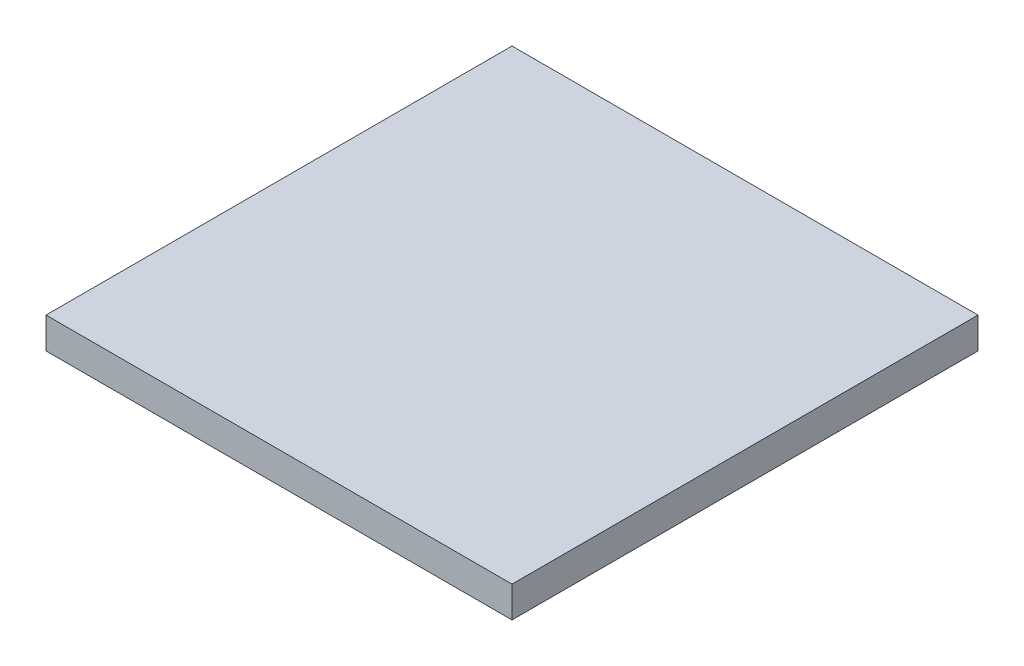
ISO-10303-21;
HEADER;
FILE_DESCRIPTION(('STEP AP214'),'2;1');
FILE_NAME('part.step','',(''),(''),'','','');
FILE_SCHEMA(('AUTOMOTIVE_DESIGN { 1 0 10303 214 1 1 1 1 }'));
ENDSEC;
DATA;
#1=APPLICATION_CONTEXT('core data for automotive mechanical design processes');
#2=APPLICATION_PROTOCOL_DEFINITION('international standard','automotive_design',2000,#1);
#3=PRODUCT_CONTEXT('',#1,'mechanical');
#4=PRODUCT('Part','Part','',(#3));
#5=PRODUCT_RELATED_PRODUCT_CATEGORY('part','',(#4));
#6=PRODUCT_DEFINITION_FORMATION('','',#4);
#7=PRODUCT_DEFINITION_CONTEXT('part definition',#1,'design');
#8=PRODUCT_DEFINITION('design','',#6,#7);
#9=PRODUCT_DEFINITION_SHAPE('','',#8);
#10=(LENGTH_UNIT() NAMED_UNIT(*) SI_UNIT(.MILLI.,.METRE.));
#11=(NAMED_UNIT(*) PLANE_ANGLE_UNIT() SI_UNIT($,.RADIAN.));
#12=(NAMED_UNIT(*) SI_UNIT($,.STERADIAN.) SOLID_ANGLE_UNIT());
#13=UNCERTAINTY_MEASURE_WITH_UNIT(LENGTH_MEASURE(1.E-05),#10,'distance_accuracy_value','');
#14=(GEOMETRIC_REPRESENTATION_CONTEXT(3) GLOBAL_UNCERTAINTY_ASSIGNED_CONTEXT((#13)) GLOBAL_UNIT_ASSIGNED_CONTEXT((#10,
#11,#12)) REPRESENTATION_CONTEXT('',''));
#15=CARTESIAN_POINT('',(0.,0.,0.));
#16=DIRECTION('',(0.,0.,1.));
#17=DIRECTION('',(1.,0.,0.));
#18=AXIS2_PLACEMENT_3D('',#15,#16,#17);
#19=CARTESIAN_POINT('',(-15.,2.,15.));
#20=DIRECTION('',(1.,0.,0.));
#21=DIRECTION('',(0.,0.,-1.));
#22=AXIS2_PLACEMENT_3D('',#19,#20,#21);
#23=PLANE('',#22);
#24=DIRECTION('',(0.,0.,1.));
#25=VECTOR('',#24,1.);
#26=CARTESIAN_POINT('',(-15.,0.,15.));
#27=LINE('',#26,#25);
#28=CARTESIAN_POINT('',(-15.,0.,-15.));
#29=VERTEX_POINT('',#28);
#30=CARTESIAN_POINT('',(-15.,0.,15.));
#31=VERTEX_POINT('',#30);
#32=EDGE_CURVE('E95',#29,#31,#27,.T.);
#33=ORIENTED_EDGE('',*,*,#32,.T.);
#34=DIRECTION('',(0.,-1.,0.));
#35=VECTOR('',#34,1.);
#36=CARTESIAN_POINT('',(-15.,2.,15.));
#37=LINE('',#36,#35);
#38=CARTESIAN_POINT('',(-15.,2.,15.));
#39=VERTEX_POINT('',#38);
#40=EDGE_CURVE('E11',#39,#31,#37,.T.);
#41=ORIENTED_EDGE('',*,*,#40,.F.);
#42=DIRECTION('',(0.,0.,1.));
#43=VECTOR('',#42,1.);
#44=CARTESIAN_POINT('',(-15.,2.,15.));
#45=LINE('',#44,#43);
#46=CARTESIAN_POINT('',(-15.,2.,-15.));
#47=VERTEX_POINT('',#46);
#48=EDGE_CURVE('E83',#47,#39,#45,.T.);
#49=ORIENTED_EDGE('',*,*,#48,.F.);
#50=DIRECTION('',(0.,-1.,0.));
#51=VECTOR('',#50,1.);
#52=CARTESIAN_POINT('',(-15.,2.,-15.));
#53=LINE('',#52,#51);
#54=EDGE_CURVE('E91',#47,#29,#53,.T.);
#55=ORIENTED_EDGE('',*,*,#54,.T.);
#56=EDGE_LOOP('',(#33,#41,#49,#55));
#57=FACE_BOUND('',#56,.T.);
#58=ADVANCED_FACE('F32',(#57),#23,.F.);
#59=CARTESIAN_POINT('',(15.,2.,15.));
#60=DIRECTION('',(0.,0.,-1.));
#61=DIRECTION('',(-1.,0.,0.));
#62=AXIS2_PLACEMENT_3D('',#59,#60,#61);
#63=PLANE('',#62);
#64=DIRECTION('',(1.,0.,0.));
#65=VECTOR('',#64,1.);
#66=CARTESIAN_POINT('',(15.,0.,15.));
#67=LINE('',#66,#65);
#68=CARTESIAN_POINT('',(15.,0.,15.));
#69=VERTEX_POINT('',#68);
#70=EDGE_CURVE('E87',#31,#69,#67,.T.);
#71=ORIENTED_EDGE('',*,*,#70,.T.);
#72=DIRECTION('',(0.,-1.,0.));
#73=VECTOR('',#72,1.);
#74=CARTESIAN_POINT('',(15.,2.,15.));
#75=LINE('',#74,#73);
#76=CARTESIAN_POINT('',(15.,2.,15.));
#77=VERTEX_POINT('',#76);
#78=EDGE_CURVE('E40',#77,#69,#75,.T.);
#79=ORIENTED_EDGE('',*,*,#78,.F.);
#80=DIRECTION('',(1.,0.,0.));
#81=VECTOR('',#80,1.);
#82=CARTESIAN_POINT('',(15.,2.,15.));
#83=LINE('',#82,#81);
#84=EDGE_CURVE('E78',#39,#77,#83,.T.);
#85=ORIENTED_EDGE('',*,*,#84,.F.);
#86=ORIENTED_EDGE('',*,*,#40,.T.);
#87=EDGE_LOOP('',(#71,#79,#85,#86));
#88=FACE_BOUND('',#87,.T.);
#89=ADVANCED_FACE('F86',(#88),#63,.F.);
#90=CARTESIAN_POINT('',(15.,2.,15.));
#91=DIRECTION('',(-1.,0.,0.));
#92=DIRECTION('',(0.,0.,1.));
#93=AXIS2_PLACEMENT_3D('',#90,#91,#92);
#94=PLANE('',#93);
#95=DIRECTION('',(0.,0.,-1.));
#96=VECTOR('',#95,1.);
#97=CARTESIAN_POINT('',(15.,0.,15.));
#98=LINE('',#97,#96);
#99=CARTESIAN_POINT('',(15.,0.,-15.));
#100=VERTEX_POINT('',#99);
#101=EDGE_CURVE('E65',#69,#100,#98,.T.);
#102=ORIENTED_EDGE('',*,*,#101,.T.);
#103=DIRECTION('',(0.,-1.,0.));
#104=VECTOR('',#103,1.);
#105=CARTESIAN_POINT('',(15.,2.,-15.));
#106=LINE('',#105,#104);
#107=CARTESIAN_POINT('',(15.,2.,-15.));
#108=VERTEX_POINT('',#107);
#109=EDGE_CURVE('E88',#108,#100,#106,.T.);
#110=ORIENTED_EDGE('',*,*,#109,.F.);
#111=DIRECTION('',(0.,0.,-1.));
#112=VECTOR('',#111,1.);
#113=CARTESIAN_POINT('',(15.,2.,15.));
#114=LINE('',#113,#112);
#115=EDGE_CURVE('E81',#77,#108,#114,.T.);
#116=ORIENTED_EDGE('',*,*,#115,.F.);
#117=ORIENTED_EDGE('',*,*,#78,.T.);
#118=EDGE_LOOP('',(#102,#110,#116,#117));
#119=FACE_BOUND('',#118,.T.);
#120=ADVANCED_FACE('F89',(#119),#94,.F.);
#121=CARTESIAN_POINT('',(15.,2.,-15.));
#122=DIRECTION('',(0.,0.,1.));
#123=DIRECTION('',(1.,0.,0.));
#124=AXIS2_PLACEMENT_3D('',#121,#122,#123);
#125=PLANE('',#124);
#126=DIRECTION('',(-1.,0.,0.));
#127=VECTOR('',#126,1.);
#128=CARTESIAN_POINT('',(15.,0.,-15.));
#129=LINE('',#128,#127);
#130=EDGE_CURVE('E71',#100,#29,#129,.T.);
#131=ORIENTED_EDGE('',*,*,#130,.T.);
#132=ORIENTED_EDGE('',*,*,#54,.F.);
#133=DIRECTION('',(-1.,0.,0.));
#134=VECTOR('',#133,1.);
#135=CARTESIAN_POINT('',(15.,2.,-15.));
#136=LINE('',#135,#134);
#137=EDGE_CURVE('E48',#108,#47,#136,.T.);
#138=ORIENTED_EDGE('',*,*,#137,.F.);
#139=ORIENTED_EDGE('',*,*,#109,.T.);
#140=EDGE_LOOP('',(#131,#132,#138,#139));
#141=FACE_BOUND('',#140,.T.);
#142=ADVANCED_FACE('F102',(#141),#125,.F.);
#143=CARTESIAN_POINT('',(0.,2.,0.));
#144=DIRECTION('',(0.,1.,0.));
#145=DIRECTION('',(0.,0.,1.));
#146=AXIS2_PLACEMENT_3D('',#143,#144,#145);
#147=PLANE('',#146);
#148=ORIENTED_EDGE('',*,*,#48,.T.);
#149=ORIENTED_EDGE('',*,*,#84,.T.);
#150=ORIENTED_EDGE('',*,*,#115,.T.);
#151=ORIENTED_EDGE('',*,*,#137,.T.);
#152=EDGE_LOOP('',(#148,#149,#150,#151));
#153=FACE_BOUND('',#152,.T.);
#154=ADVANCED_FACE('F79',(#153),#147,.T.);
#155=CARTESIAN_POINT('',(0.,0.,0.));
#156=DIRECTION('',(0.,1.,0.));
#157=DIRECTION('',(0.,0.,1.));
#158=AXIS2_PLACEMENT_3D('',#155,#156,#157);
#159=PLANE('',#158);
#160=ORIENTED_EDGE('',*,*,#32,.F.);
#161=ORIENTED_EDGE('',*,*,#130,.F.);
#162=ORIENTED_EDGE('',*,*,#101,.F.);
#163=ORIENTED_EDGE('',*,*,#70,.F.);
#164=EDGE_LOOP('',(#160,#161,#162,#163));
#165=FACE_BOUND('',#164,.T.);
#166=ADVANCED_FACE('F105',(#165),#159,.F.);
#167=CLOSED_SHELL('',(#58,#89,#120,#142,#154,#166));
#168=MANIFOLD_SOLID_BREP('B2',#167);
#169=ADVANCED_BREP_SHAPE_REPRESENTATION('',(#18,#168),#14);
#170=SHAPE_DEFINITION_REPRESENTATION(#9,#169);
ENDSEC;
END-ISO-10303-21;
